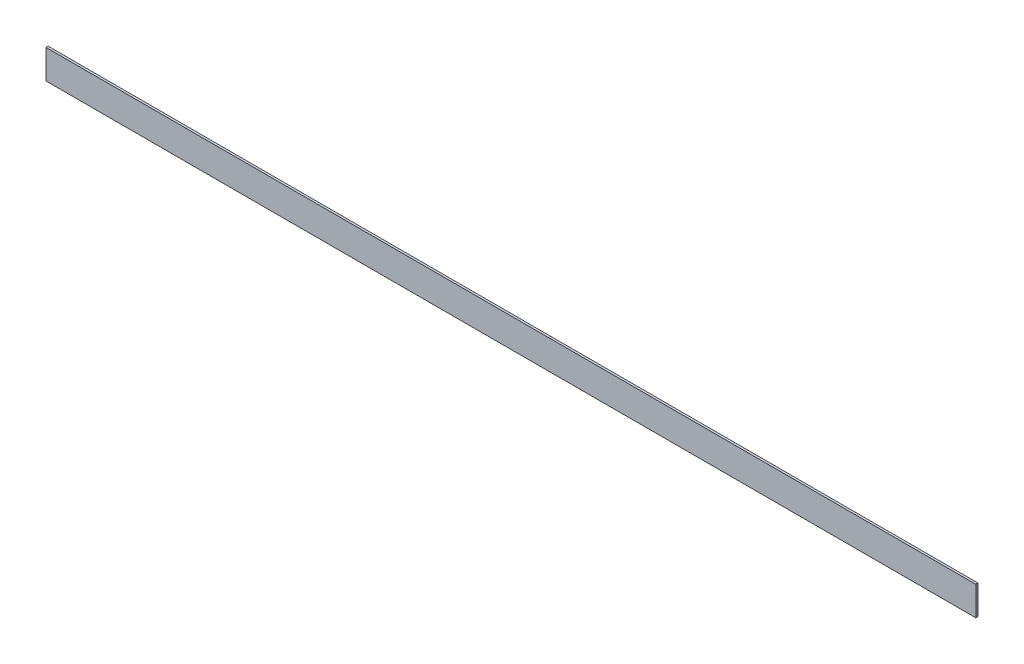
ISO-10303-21;
HEADER;
FILE_DESCRIPTION(('STEP AP214'),'2;1');
FILE_NAME('part.step','',(''),(''),'','','');
FILE_SCHEMA(('AUTOMOTIVE_DESIGN { 1 0 10303 214 1 1 1 1 }'));
ENDSEC;
DATA;
#1=APPLICATION_CONTEXT('core data for automotive mechanical design processes');
#2=APPLICATION_PROTOCOL_DEFINITION('international standard','automotive_design',2000,#1);
#3=PRODUCT_CONTEXT('',#1,'mechanical');
#4=PRODUCT('Part','Part','',(#3));
#5=PRODUCT_RELATED_PRODUCT_CATEGORY('part','',(#4));
#6=PRODUCT_DEFINITION_FORMATION('','',#4);
#7=PRODUCT_DEFINITION_CONTEXT('part definition',#1,'design');
#8=PRODUCT_DEFINITION('design','',#6,#7);
#9=PRODUCT_DEFINITION_SHAPE('','',#8);
#10=(LENGTH_UNIT() NAMED_UNIT(*) SI_UNIT(.MILLI.,.METRE.));
#11=(NAMED_UNIT(*) PLANE_ANGLE_UNIT() SI_UNIT($,.RADIAN.));
#12=(NAMED_UNIT(*) SI_UNIT($,.STERADIAN.) SOLID_ANGLE_UNIT());
#13=UNCERTAINTY_MEASURE_WITH_UNIT(LENGTH_MEASURE(1.E-05),#10,'distance_accuracy_value','');
#14=(GEOMETRIC_REPRESENTATION_CONTEXT(3) GLOBAL_UNCERTAINTY_ASSIGNED_CONTEXT((#13)) GLOBAL_UNIT_ASSIGNED_CONTEXT((#10,
#11,#12)) REPRESENTATION_CONTEXT('',''));
#15=CARTESIAN_POINT('',(0.,0.,0.));
#16=DIRECTION('',(0.,0.,1.));
#17=DIRECTION('',(1.,0.,0.));
#18=AXIS2_PLACEMENT_3D('',#15,#16,#17);
#19=CARTESIAN_POINT('',(30.,1950.,40.));
#20=DIRECTION('',(1.,0.,0.));
#21=DIRECTION('',(0.,0.,-1.));
#22=AXIS2_PLACEMENT_3D('',#19,#20,#21);
#23=PLANE('',#22);
#24=DIRECTION('',(0.,-1.,0.));
#25=VECTOR('',#24,1.);
#26=CARTESIAN_POINT('',(30.,1950.,38.5));
#27=LINE('',#26,#25);
#28=CARTESIAN_POINT('',(30.,1970.,38.5));
#29=VERTEX_POINT('',#28);
#30=CARTESIAN_POINT('',(30.,1950.,38.5));
#31=VERTEX_POINT('',#30);
#32=EDGE_CURVE('E102',#29,#31,#27,.T.);
#33=ORIENTED_EDGE('',*,*,#32,.T.);
#34=DIRECTION('',(0.,0.,-1.));
#35=VECTOR('',#34,1.);
#36=CARTESIAN_POINT('',(30.,1950.,40.));
#37=LINE('',#36,#35);
#38=CARTESIAN_POINT('',(30.,1950.,40.));
#39=VERTEX_POINT('',#38);
#40=EDGE_CURVE('E11',#39,#31,#37,.T.);
#41=ORIENTED_EDGE('',*,*,#40,.F.);
#42=DIRECTION('',(0.,-1.,0.));
#43=VECTOR('',#42,1.);
#44=CARTESIAN_POINT('',(30.,1950.,40.));
#45=LINE('',#44,#43);
#46=CARTESIAN_POINT('',(30.,1970.,40.));
#47=VERTEX_POINT('',#46);
#48=EDGE_CURVE('E90',#47,#39,#45,.T.);
#49=ORIENTED_EDGE('',*,*,#48,.F.);
#50=DIRECTION('',(0.,0.,-1.));
#51=VECTOR('',#50,1.);
#52=CARTESIAN_POINT('',(30.,1970.,40.));
#53=LINE('',#52,#51);
#54=EDGE_CURVE('E98',#47,#29,#53,.T.);
#55=ORIENTED_EDGE('',*,*,#54,.T.);
#56=EDGE_LOOP('',(#33,#41,#49,#55));
#57=FACE_BOUND('',#56,.T.);
#58=ADVANCED_FACE('F39',(#57),#23,.F.);
#59=CARTESIAN_POINT('',(30.,1950.,40.));
#60=DIRECTION('',(0.,1.,0.));
#61=DIRECTION('',(0.,0.,1.));
#62=AXIS2_PLACEMENT_3D('',#59,#60,#61);
#63=PLANE('',#62);
#64=DIRECTION('',(1.,0.,0.));
#65=VECTOR('',#64,1.);
#66=CARTESIAN_POINT('',(30.,1950.,38.5));
#67=LINE('',#66,#65);
#68=CARTESIAN_POINT('',(670.,1950.,38.5));
#69=VERTEX_POINT('',#68);
#70=EDGE_CURVE('E94',#31,#69,#67,.T.);
#71=ORIENTED_EDGE('',*,*,#70,.T.);
#72=DIRECTION('',(0.,0.,-1.));
#73=VECTOR('',#72,1.);
#74=CARTESIAN_POINT('',(670.,1950.,40.));
#75=LINE('',#74,#73);
#76=CARTESIAN_POINT('',(670.,1950.,40.));
#77=VERTEX_POINT('',#76);
#78=EDGE_CURVE('E47',#77,#69,#75,.T.);
#79=ORIENTED_EDGE('',*,*,#78,.F.);
#80=DIRECTION('',(1.,0.,0.));
#81=VECTOR('',#80,1.);
#82=CARTESIAN_POINT('',(30.,1950.,40.));
#83=LINE('',#82,#81);
#84=EDGE_CURVE('E85',#39,#77,#83,.T.);
#85=ORIENTED_EDGE('',*,*,#84,.F.);
#86=ORIENTED_EDGE('',*,*,#40,.T.);
#87=EDGE_LOOP('',(#71,#79,#85,#86));
#88=FACE_BOUND('',#87,.T.);
#89=ADVANCED_FACE('F93',(#88),#63,.F.);
#90=CARTESIAN_POINT('',(670.,1950.,40.));
#91=DIRECTION('',(-1.,0.,0.));
#92=DIRECTION('',(0.,0.,1.));
#93=AXIS2_PLACEMENT_3D('',#90,#91,#92);
#94=PLANE('',#93);
#95=DIRECTION('',(0.,1.,0.));
#96=VECTOR('',#95,1.);
#97=CARTESIAN_POINT('',(670.,1950.,38.5));
#98=LINE('',#97,#96);
#99=CARTESIAN_POINT('',(670.,1970.,38.5));
#100=VERTEX_POINT('',#99);
#101=EDGE_CURVE('E72',#69,#100,#98,.T.);
#102=ORIENTED_EDGE('',*,*,#101,.T.);
#103=DIRECTION('',(0.,0.,-1.));
#104=VECTOR('',#103,1.);
#105=CARTESIAN_POINT('',(670.,1970.,40.));
#106=LINE('',#105,#104);
#107=CARTESIAN_POINT('',(670.,1970.,40.));
#108=VERTEX_POINT('',#107);
#109=EDGE_CURVE('E95',#108,#100,#106,.T.);
#110=ORIENTED_EDGE('',*,*,#109,.F.);
#111=DIRECTION('',(0.,1.,0.));
#112=VECTOR('',#111,1.);
#113=CARTESIAN_POINT('',(670.,1950.,40.));
#114=LINE('',#113,#112);
#115=EDGE_CURVE('E88',#77,#108,#114,.T.);
#116=ORIENTED_EDGE('',*,*,#115,.F.);
#117=ORIENTED_EDGE('',*,*,#78,.T.);
#118=EDGE_LOOP('',(#102,#110,#116,#117));
#119=FACE_BOUND('',#118,.T.);
#120=ADVANCED_FACE('F96',(#119),#94,.F.);
#121=CARTESIAN_POINT('',(30.,1970.,40.));
#122=DIRECTION('',(0.,-1.,0.));
#123=DIRECTION('',(0.,0.,-1.));
#124=AXIS2_PLACEMENT_3D('',#121,#122,#123);
#125=PLANE('',#124);
#126=DIRECTION('',(-1.,0.,0.));
#127=VECTOR('',#126,1.);
#128=CARTESIAN_POINT('',(30.,1970.,38.5));
#129=LINE('',#128,#127);
#130=EDGE_CURVE('E78',#100,#29,#129,.T.);
#131=ORIENTED_EDGE('',*,*,#130,.T.);
#132=ORIENTED_EDGE('',*,*,#54,.F.);
#133=DIRECTION('',(-1.,0.,0.));
#134=VECTOR('',#133,1.);
#135=CARTESIAN_POINT('',(30.,1970.,40.));
#136=LINE('',#135,#134);
#137=EDGE_CURVE('E55',#108,#47,#136,.T.);
#138=ORIENTED_EDGE('',*,*,#137,.F.);
#139=ORIENTED_EDGE('',*,*,#109,.T.);
#140=EDGE_LOOP('',(#131,#132,#138,#139));
#141=FACE_BOUND('',#140,.T.);
#142=ADVANCED_FACE('F109',(#141),#125,.F.);
#143=CARTESIAN_POINT('',(0.,0.,40.));
#144=DIRECTION('',(0.,0.,-1.));
#145=DIRECTION('',(-1.,0.,0.));
#146=AXIS2_PLACEMENT_3D('',#143,#144,#145);
#147=PLANE('',#146);
#148=ORIENTED_EDGE('',*,*,#48,.T.);
#149=ORIENTED_EDGE('',*,*,#84,.T.);
#150=ORIENTED_EDGE('',*,*,#115,.T.);
#151=ORIENTED_EDGE('',*,*,#137,.T.);
#152=EDGE_LOOP('',(#148,#149,#150,#151));
#153=FACE_BOUND('',#152,.T.);
#154=ADVANCED_FACE('F86',(#153),#147,.F.);
#155=CARTESIAN_POINT('',(0.,0.,38.5));
#156=DIRECTION('',(0.,0.,-1.));
#157=DIRECTION('',(-1.,0.,0.));
#158=AXIS2_PLACEMENT_3D('',#155,#156,#157);
#159=PLANE('',#158);
#160=ORIENTED_EDGE('',*,*,#32,.F.);
#161=ORIENTED_EDGE('',*,*,#130,.F.);
#162=ORIENTED_EDGE('',*,*,#101,.F.);
#163=ORIENTED_EDGE('',*,*,#70,.F.);
#164=EDGE_LOOP('',(#160,#161,#162,#163));
#165=FACE_BOUND('',#164,.T.);
#166=ADVANCED_FACE('F112',(#165),#159,.T.);
#167=CLOSED_SHELL('',(#58,#89,#120,#142,#154,#166));
#168=MANIFOLD_SOLID_BREP('B2',#167);
#169=ADVANCED_BREP_SHAPE_REPRESENTATION('',(#18,#168),#14);
#170=SHAPE_DEFINITION_REPRESENTATION(#9,#169);
ENDSEC;
END-ISO-10303-21;
